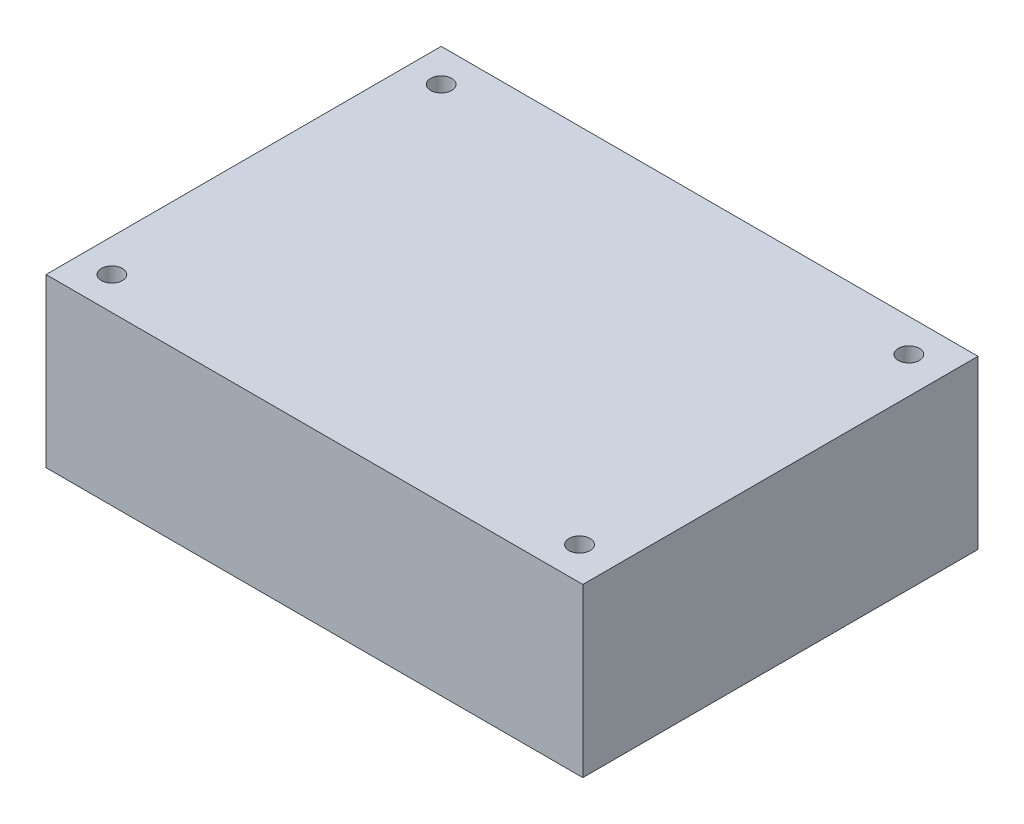
ISO-10303-21;
HEADER;
FILE_DESCRIPTION(('STEP AP214'),'2;1');
FILE_NAME('part.step','',(''),(''),'','','');
FILE_SCHEMA(('AUTOMOTIVE_DESIGN { 1 0 10303 214 1 1 1 1 }'));
ENDSEC;
DATA;
#1=APPLICATION_CONTEXT('core data for automotive mechanical design processes');
#2=APPLICATION_PROTOCOL_DEFINITION('international standard','automotive_design',2000,#1);
#3=PRODUCT_CONTEXT('',#1,'mechanical');
#4=PRODUCT('Part','Part','',(#3));
#5=PRODUCT_RELATED_PRODUCT_CATEGORY('part','',(#4));
#6=PRODUCT_DEFINITION_FORMATION('','',#4);
#7=PRODUCT_DEFINITION_CONTEXT('part definition',#1,'design');
#8=PRODUCT_DEFINITION('design','',#6,#7);
#9=PRODUCT_DEFINITION_SHAPE('','',#8);
#10=(LENGTH_UNIT() NAMED_UNIT(*) SI_UNIT(.MILLI.,.METRE.));
#11=(NAMED_UNIT(*) PLANE_ANGLE_UNIT() SI_UNIT($,.RADIAN.));
#12=(NAMED_UNIT(*) SI_UNIT($,.STERADIAN.) SOLID_ANGLE_UNIT());
#13=UNCERTAINTY_MEASURE_WITH_UNIT(LENGTH_MEASURE(1.E-05),#10,'distance_accuracy_value','');
#14=(GEOMETRIC_REPRESENTATION_CONTEXT(3) GLOBAL_UNCERTAINTY_ASSIGNED_CONTEXT((#13)) GLOBAL_UNIT_ASSIGNED_CONTEXT((#10,
#11,#12)) REPRESENTATION_CONTEXT('',''));
#15=CARTESIAN_POINT('',(0.,0.,0.));
#16=DIRECTION('',(0.,0.,1.));
#17=DIRECTION('',(1.,0.,0.));
#18=AXIS2_PLACEMENT_3D('',#15,#16,#17);
#19=CARTESIAN_POINT('',(-40.7499947,25.4,-29.99994));
#20=DIRECTION('',(1.,0.,0.));
#21=DIRECTION('',(0.,0.,-1.));
#22=AXIS2_PLACEMENT_3D('',#19,#20,#21);
#23=PLANE('',#22);
#24=DIRECTION('',(0.,0.,1.));
#25=VECTOR('',#24,1.);
#26=CARTESIAN_POINT('',(-40.7499947,0.,-29.99994));
#27=LINE('',#26,#25);
#28=CARTESIAN_POINT('',(-40.7499947,0.,-29.99994));
#29=VERTEX_POINT('',#28);
#30=CARTESIAN_POINT('',(-40.7499947,0.,29.99994));
#31=VERTEX_POINT('',#30);
#32=EDGE_CURVE('E107',#29,#31,#27,.T.);
#33=ORIENTED_EDGE('',*,*,#32,.T.);
#34=DIRECTION('',(0.,-1.,0.));
#35=VECTOR('',#34,1.);
#36=CARTESIAN_POINT('',(-40.7499947,25.4,29.99994));
#37=LINE('',#36,#35);
#38=CARTESIAN_POINT('',(-40.7499947,25.4,29.99994));
#39=VERTEX_POINT('',#38);
#40=EDGE_CURVE('E11',#39,#31,#37,.T.);
#41=ORIENTED_EDGE('',*,*,#40,.F.);
#42=DIRECTION('',(0.,0.,1.));
#43=VECTOR('',#42,1.);
#44=CARTESIAN_POINT('',(-40.7499947,25.4,-29.99994));
#45=LINE('',#44,#43);
#46=CARTESIAN_POINT('',(-40.7499947,25.4,-29.99994));
#47=VERTEX_POINT('',#46);
#48=EDGE_CURVE('E91',#47,#39,#45,.T.);
#49=ORIENTED_EDGE('',*,*,#48,.F.);
#50=DIRECTION('',(0.,-1.,0.));
#51=VECTOR('',#50,1.);
#52=CARTESIAN_POINT('',(-40.7499947,25.4,-29.99994));
#53=LINE('',#52,#51);
#54=EDGE_CURVE('E103',#47,#29,#53,.T.);
#55=ORIENTED_EDGE('',*,*,#54,.T.);
#56=EDGE_LOOP('',(#33,#41,#49,#55));
#57=FACE_BOUND('',#56,.T.);
#58=ADVANCED_FACE('F39',(#57),#23,.F.);
#59=CARTESIAN_POINT('',(-40.7499947,25.4,29.99994));
#60=DIRECTION('',(0.,0.,-1.));
#61=DIRECTION('',(-1.,0.,0.));
#62=AXIS2_PLACEMENT_3D('',#59,#60,#61);
#63=PLANE('',#62);
#64=DIRECTION('',(1.,0.,0.));
#65=VECTOR('',#64,1.);
#66=CARTESIAN_POINT('',(-40.7499947,0.,29.99994));
#67=LINE('',#66,#65);
#68=CARTESIAN_POINT('',(40.7499947,0.,29.99994));
#69=VERTEX_POINT('',#68);
#70=EDGE_CURVE('E96',#31,#69,#67,.T.);
#71=ORIENTED_EDGE('',*,*,#70,.T.);
#72=DIRECTION('',(0.,-1.,0.));
#73=VECTOR('',#72,1.);
#74=CARTESIAN_POINT('',(40.7499947,25.4,29.99994));
#75=LINE('',#74,#73);
#76=CARTESIAN_POINT('',(40.7499947,25.4,29.99994));
#77=VERTEX_POINT('',#76);
#78=EDGE_CURVE('E48',#77,#69,#75,.T.);
#79=ORIENTED_EDGE('',*,*,#78,.F.);
#80=DIRECTION('',(1.,0.,0.));
#81=VECTOR('',#80,1.);
#82=CARTESIAN_POINT('',(-40.7499947,25.4,29.99994));
#83=LINE('',#82,#81);
#84=EDGE_CURVE('E86',#39,#77,#83,.T.);
#85=ORIENTED_EDGE('',*,*,#84,.F.);
#86=ORIENTED_EDGE('',*,*,#40,.T.);
#87=EDGE_LOOP('',(#71,#79,#85,#86));
#88=FACE_BOUND('',#87,.T.);
#89=ADVANCED_FACE('F95',(#88),#63,.F.);
#90=CARTESIAN_POINT('',(40.7499947,25.4,-29.99994));
#91=DIRECTION('',(-1.,0.,0.));
#92=DIRECTION('',(0.,0.,1.));
#93=AXIS2_PLACEMENT_3D('',#90,#91,#92);
#94=PLANE('',#93);
#95=DIRECTION('',(0.,0.,-1.));
#96=VECTOR('',#95,1.);
#97=CARTESIAN_POINT('',(40.7499947,0.,-29.99994));
#98=LINE('',#97,#96);
#99=CARTESIAN_POINT('',(40.7499947,0.,-29.99994));
#100=VERTEX_POINT('',#99);
#101=EDGE_CURVE('E73',#69,#100,#98,.T.);
#102=ORIENTED_EDGE('',*,*,#101,.T.);
#103=DIRECTION('',(0.,-1.,0.));
#104=VECTOR('',#103,1.);
#105=CARTESIAN_POINT('',(40.7499947,25.4,-29.99994));
#106=LINE('',#105,#104);
#107=CARTESIAN_POINT('',(40.7499947,25.4,-29.99994));
#108=VERTEX_POINT('',#107);
#109=EDGE_CURVE('E98',#108,#100,#106,.T.);
#110=ORIENTED_EDGE('',*,*,#109,.F.);
#111=DIRECTION('',(0.,0.,-1.));
#112=VECTOR('',#111,1.);
#113=CARTESIAN_POINT('',(40.7499947,25.4,-29.99994));
#114=LINE('',#113,#112);
#115=EDGE_CURVE('E89',#77,#108,#114,.T.);
#116=ORIENTED_EDGE('',*,*,#115,.F.);
#117=ORIENTED_EDGE('',*,*,#78,.T.);
#118=EDGE_LOOP('',(#102,#110,#116,#117));
#119=FACE_BOUND('',#118,.T.);
#120=ADVANCED_FACE('F99',(#119),#94,.F.);
#121=CARTESIAN_POINT('',(-40.7499947,25.4,-29.99994));
#122=DIRECTION('',(0.,0.,1.));
#123=DIRECTION('',(1.,0.,0.));
#124=AXIS2_PLACEMENT_3D('',#121,#122,#123);
#125=PLANE('',#124);
#126=DIRECTION('',(-1.,0.,0.));
#127=VECTOR('',#126,1.);
#128=CARTESIAN_POINT('',(-40.7499947,0.,-29.99994));
#129=LINE('',#128,#127);
#130=EDGE_CURVE('E79',#100,#29,#129,.T.);
#131=ORIENTED_EDGE('',*,*,#130,.T.);
#132=ORIENTED_EDGE('',*,*,#54,.F.);
#133=DIRECTION('',(-1.,0.,0.));
#134=VECTOR('',#133,1.);
#135=CARTESIAN_POINT('',(-40.7499947,25.4,-29.99994));
#136=LINE('',#135,#134);
#137=EDGE_CURVE('E56',#108,#47,#136,.T.);
#138=ORIENTED_EDGE('',*,*,#137,.F.);
#139=ORIENTED_EDGE('',*,*,#109,.T.);
#140=EDGE_LOOP('',(#131,#132,#138,#139));
#141=FACE_BOUND('',#140,.T.);
#142=ADVANCED_FACE('F121',(#141),#125,.F.);
#143=CARTESIAN_POINT('',(0.,25.4,0.));
#144=DIRECTION('',(0.,1.,0.));
#145=DIRECTION('',(0.,0.,1.));
#146=AXIS2_PLACEMENT_3D('',#143,#144,#145);
#147=PLANE('',#146);
#148=CARTESIAN_POINT('',(-35.7500047,25.4,-24.99995));
#149=DIRECTION('',(0.,1.,0.));
#150=DIRECTION('',(0.,0.,1.));
#151=AXIS2_PLACEMENT_3D('',#148,#149,#150);
#152=CIRCLE('',#151,1.6);
#153=CARTESIAN_POINT('',(-35.7500047,25.4,-23.39995));
#154=VERTEX_POINT('',#153);
#155=EDGE_CURVE('E155',#154,#154,#152,.T.);
#156=ORIENTED_EDGE('',*,*,#155,.F.);
#157=EDGE_LOOP('',(#156));
#158=FACE_BOUND('',#157,.T.);
#159=CARTESIAN_POINT('',(35.2501073,25.4,24.99995));
#160=DIRECTION('',(0.,1.,0.));
#161=DIRECTION('',(0.,0.,1.));
#162=AXIS2_PLACEMENT_3D('',#159,#160,#161);
#163=CIRCLE('',#162,1.6);
#164=CARTESIAN_POINT('',(35.2501073,25.4,26.59995));
#165=VERTEX_POINT('',#164);
#166=EDGE_CURVE('E147',#165,#165,#163,.T.);
#167=ORIENTED_EDGE('',*,*,#166,.F.);
#168=EDGE_LOOP('',(#167));
#169=FACE_BOUND('',#168,.T.);
#170=CARTESIAN_POINT('',(35.2501073,25.4,-24.99995));
#171=DIRECTION('',(0.,1.,0.));
#172=DIRECTION('',(0.,0.,1.));
#173=AXIS2_PLACEMENT_3D('',#170,#171,#172);
#174=CIRCLE('',#173,1.6);
#175=CARTESIAN_POINT('',(35.2501073,25.4,-23.39995));
#176=VERTEX_POINT('',#175);
#177=EDGE_CURVE('E139',#176,#176,#174,.T.);
#178=ORIENTED_EDGE('',*,*,#177,.F.);
#179=EDGE_LOOP('',(#178));
#180=FACE_BOUND('',#179,.T.);
#181=CARTESIAN_POINT('',(-35.7500047,25.4,24.99995));
#182=DIRECTION('',(0.,1.,0.));
#183=DIRECTION('',(0.,0.,1.));
#184=AXIS2_PLACEMENT_3D('',#181,#182,#183);
#185=CIRCLE('',#184,1.6);
#186=CARTESIAN_POINT('',(-35.7500047,25.4,26.59995));
#187=VERTEX_POINT('',#186);
#188=EDGE_CURVE('E131',#187,#187,#185,.T.);
#189=ORIENTED_EDGE('',*,*,#188,.F.);
#190=EDGE_LOOP('',(#189));
#191=FACE_BOUND('',#190,.T.);
#192=ORIENTED_EDGE('',*,*,#48,.T.);
#193=ORIENTED_EDGE('',*,*,#84,.T.);
#194=ORIENTED_EDGE('',*,*,#115,.T.);
#195=ORIENTED_EDGE('',*,*,#137,.T.);
#196=EDGE_LOOP('',(#192,#193,#194,#195));
#197=FACE_BOUND('',#196,.T.);
#198=ADVANCED_FACE('F87',(#158,#169,#180,#191,#197),#147,.T.);
#199=CARTESIAN_POINT('',(0.,0.,0.));
#200=DIRECTION('',(0.,1.,0.));
#201=DIRECTION('',(0.,0.,1.));
#202=AXIS2_PLACEMENT_3D('',#199,#200,#201);
#203=PLANE('',#202);
#204=CARTESIAN_POINT('',(-35.7500047,0.,-24.99995));
#205=DIRECTION('',(0.,1.,0.));
#206=DIRECTION('',(0.,0.,1.));
#207=AXIS2_PLACEMENT_3D('',#204,#205,#206);
#208=CIRCLE('',#207,1.6);
#209=CARTESIAN_POINT('',(-35.7500047,0.,-23.39995));
#210=VERTEX_POINT('',#209);
#211=EDGE_CURVE('E151',#210,#210,#208,.T.);
#212=ORIENTED_EDGE('',*,*,#211,.T.);
#213=EDGE_LOOP('',(#212));
#214=FACE_BOUND('',#213,.T.);
#215=CARTESIAN_POINT('',(35.2501073,0.,24.99995));
#216=DIRECTION('',(0.,1.,0.));
#217=DIRECTION('',(0.,0.,1.));
#218=AXIS2_PLACEMENT_3D('',#215,#216,#217);
#219=CIRCLE('',#218,1.6);
#220=CARTESIAN_POINT('',(35.2501073,0.,26.59995));
#221=VERTEX_POINT('',#220);
#222=EDGE_CURVE('E143',#221,#221,#219,.T.);
#223=ORIENTED_EDGE('',*,*,#222,.T.);
#224=EDGE_LOOP('',(#223));
#225=FACE_BOUND('',#224,.T.);
#226=CARTESIAN_POINT('',(35.2501073,0.,-24.99995));
#227=DIRECTION('',(0.,1.,0.));
#228=DIRECTION('',(0.,0.,1.));
#229=AXIS2_PLACEMENT_3D('',#226,#227,#228);
#230=CIRCLE('',#229,1.6);
#231=CARTESIAN_POINT('',(35.2501073,0.,-23.39995));
#232=VERTEX_POINT('',#231);
#233=EDGE_CURVE('E135',#232,#232,#230,.T.);
#234=ORIENTED_EDGE('',*,*,#233,.T.);
#235=EDGE_LOOP('',(#234));
#236=FACE_BOUND('',#235,.T.);
#237=CARTESIAN_POINT('',(-35.7500047,0.,24.99995));
#238=DIRECTION('',(0.,1.,0.));
#239=DIRECTION('',(0.,0.,1.));
#240=AXIS2_PLACEMENT_3D('',#237,#238,#239);
#241=CIRCLE('',#240,1.6);
#242=CARTESIAN_POINT('',(-35.7500047,0.,26.59995));
#243=VERTEX_POINT('',#242);
#244=EDGE_CURVE('E111',#243,#243,#241,.T.);
#245=ORIENTED_EDGE('',*,*,#244,.T.);
#246=EDGE_LOOP('',(#245));
#247=FACE_BOUND('',#246,.T.);
#248=ORIENTED_EDGE('',*,*,#32,.F.);
#249=ORIENTED_EDGE('',*,*,#130,.F.);
#250=ORIENTED_EDGE('',*,*,#101,.F.);
#251=ORIENTED_EDGE('',*,*,#70,.F.);
#252=EDGE_LOOP('',(#248,#249,#250,#251));
#253=FACE_BOUND('',#252,.T.);
#254=ADVANCED_FACE('F124',(#214,#225,#236,#247,#253),#203,.F.);
#255=CARTESIAN_POINT('',(-35.7500047,25.4,24.99995));
#256=DIRECTION('',(0.,1.,0.));
#257=DIRECTION('',(0.,0.,1.));
#258=AXIS2_PLACEMENT_3D('',#255,#256,#257);
#259=CYLINDRICAL_SURFACE('',#258,1.6);
#260=ORIENTED_EDGE('',*,*,#244,.F.);
#261=EDGE_LOOP('',(#260));
#262=FACE_BOUND('',#261,.T.);
#263=ORIENTED_EDGE('',*,*,#188,.T.);
#264=EDGE_LOOP('',(#263));
#265=FACE_BOUND('',#264,.T.);
#266=ADVANCED_FACE('F171',(#262,#265),#259,.F.);
#267=CARTESIAN_POINT('',(35.2501073,25.4,-24.99995));
#268=DIRECTION('',(0.,1.,0.));
#269=DIRECTION('',(0.,0.,1.));
#270=AXIS2_PLACEMENT_3D('',#267,#268,#269);
#271=CYLINDRICAL_SURFACE('',#270,1.6);
#272=ORIENTED_EDGE('',*,*,#233,.F.);
#273=EDGE_LOOP('',(#272));
#274=FACE_BOUND('',#273,.T.);
#275=ORIENTED_EDGE('',*,*,#177,.T.);
#276=EDGE_LOOP('',(#275));
#277=FACE_BOUND('',#276,.T.);
#278=ADVANCED_FACE('F173',(#274,#277),#271,.F.);
#279=CARTESIAN_POINT('',(35.2501073,25.4,24.99995));
#280=DIRECTION('',(0.,1.,0.));
#281=DIRECTION('',(0.,0.,1.));
#282=AXIS2_PLACEMENT_3D('',#279,#280,#281);
#283=CYLINDRICAL_SURFACE('',#282,1.6);
#284=ORIENTED_EDGE('',*,*,#222,.F.);
#285=EDGE_LOOP('',(#284));
#286=FACE_BOUND('',#285,.T.);
#287=ORIENTED_EDGE('',*,*,#166,.T.);
#288=EDGE_LOOP('',(#287));
#289=FACE_BOUND('',#288,.T.);
#290=ADVANCED_FACE('F180',(#286,#289),#283,.F.);
#291=CARTESIAN_POINT('',(-35.7500047,25.4,-24.99995));
#292=DIRECTION('',(0.,1.,0.));
#293=DIRECTION('',(0.,0.,1.));
#294=AXIS2_PLACEMENT_3D('',#291,#292,#293);
#295=CYLINDRICAL_SURFACE('',#294,1.6);
#296=ORIENTED_EDGE('',*,*,#211,.F.);
#297=EDGE_LOOP('',(#296));
#298=FACE_BOUND('',#297,.T.);
#299=ORIENTED_EDGE('',*,*,#155,.T.);
#300=EDGE_LOOP('',(#299));
#301=FACE_BOUND('',#300,.T.);
#302=ADVANCED_FACE('F160',(#298,#301),#295,.F.);
#303=CLOSED_SHELL('',(#58,#89,#120,#142,#198,#254,#266,#278,#290,#302));
#304=MANIFOLD_SOLID_BREP('B2',#303);
#305=ADVANCED_BREP_SHAPE_REPRESENTATION('',(#18,#304),#14);
#306=SHAPE_DEFINITION_REPRESENTATION(#9,#305);
ENDSEC;
END-ISO-10303-21;
